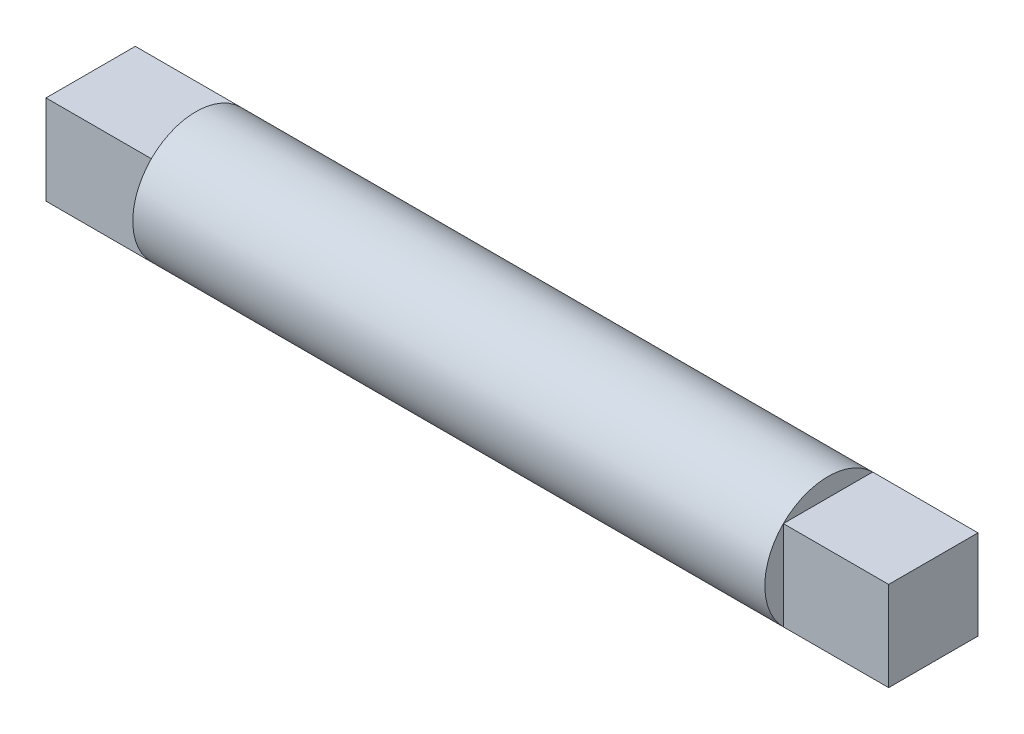
ISO-10303-21;
HEADER;
FILE_DESCRIPTION(('STEP AP214'),'2;1');
FILE_NAME('part.step','',(''),(''),'','','');
FILE_SCHEMA(('AUTOMOTIVE_DESIGN { 1 0 10303 214 1 1 1 1 }'));
ENDSEC;
DATA;
#1=APPLICATION_CONTEXT('core data for automotive mechanical design processes');
#2=APPLICATION_PROTOCOL_DEFINITION('international standard','automotive_design',2000,#1);
#3=PRODUCT_CONTEXT('',#1,'mechanical');
#4=PRODUCT('Part','Part','',(#3));
#5=PRODUCT_RELATED_PRODUCT_CATEGORY('part','',(#4));
#6=PRODUCT_DEFINITION_FORMATION('','',#4);
#7=PRODUCT_DEFINITION_CONTEXT('part definition',#1,'design');
#8=PRODUCT_DEFINITION('design','',#6,#7);
#9=PRODUCT_DEFINITION_SHAPE('','',#8);
#10=(LENGTH_UNIT() NAMED_UNIT(*) SI_UNIT(.MILLI.,.METRE.));
#11=(NAMED_UNIT(*) PLANE_ANGLE_UNIT() SI_UNIT($,.RADIAN.));
#12=(NAMED_UNIT(*) SI_UNIT($,.STERADIAN.) SOLID_ANGLE_UNIT());
#13=UNCERTAINTY_MEASURE_WITH_UNIT(LENGTH_MEASURE(1.E-05),#10,'distance_accuracy_value','');
#14=(GEOMETRIC_REPRESENTATION_CONTEXT(3) GLOBAL_UNCERTAINTY_ASSIGNED_CONTEXT((#13)) GLOBAL_UNIT_ASSIGNED_CONTEXT((#10,
#11,#12)) REPRESENTATION_CONTEXT('',''));
#15=CARTESIAN_POINT('',(0.,0.,0.));
#16=DIRECTION('',(0.,0.,1.));
#17=DIRECTION('',(1.,0.,0.));
#18=AXIS2_PLACEMENT_3D('',#15,#16,#17);
#19=CARTESIAN_POINT('',(-15.,0.,0.));
#20=DIRECTION('',(-1.,0.,0.));
#21=DIRECTION('',(0.,0.,-1.));
#22=AXIS2_PLACEMENT_3D('',#19,#20,#21);
#23=PLANE('',#22);
#24=CARTESIAN_POINT('',(-15.,0.,0.));
#25=DIRECTION('',(1.,0.,0.));
#26=DIRECTION('',(0.,0.,-1.));
#27=AXIS2_PLACEMENT_3D('',#24,#25,#26);
#28=CIRCLE('',#27,3.);
#29=CARTESIAN_POINT('',(-15.,-2.12263986582746,-2.12));
#30=VERTEX_POINT('',#29);
#31=CARTESIAN_POINT('',(-15.,2.12263986582746,-2.12));
#32=VERTEX_POINT('',#31);
#33=EDGE_CURVE('E106',#30,#32,#28,.T.);
#34=ORIENTED_EDGE('',*,*,#33,.F.);
#35=DIRECTION('',(0.,1.,0.));
#36=VECTOR('',#35,1.);
#37=CARTESIAN_POINT('',(-15.,2.12263986582746,-2.12));
#38=LINE('',#37,#36);
#39=EDGE_CURVE('E49',#30,#32,#38,.T.);
#40=ORIENTED_EDGE('',*,*,#39,.T.);
#41=EDGE_LOOP('',(#34,#40));
#42=FACE_BOUND('',#41,.T.);
#43=ADVANCED_FACE('F33',(#42),#23,.T.);
#44=CARTESIAN_POINT('',(-15.,2.12263986582746,2.12));
#45=VERTEX_POINT('',#44);
#46=EDGE_CURVE('E138',#32,#45,#28,.T.);
#47=ORIENTED_EDGE('',*,*,#46,.F.);
#48=DIRECTION('',(0.,0.,1.));
#49=VECTOR('',#48,1.);
#50=CARTESIAN_POINT('',(-15.,2.12263986582746,2.12));
#51=LINE('',#50,#49);
#52=EDGE_CURVE('E117',#32,#45,#51,.T.);
#53=ORIENTED_EDGE('',*,*,#52,.T.);
#54=EDGE_LOOP('',(#47,#53));
#55=FACE_BOUND('',#54,.T.);
#56=ADVANCED_FACE('F208',(#55),#23,.T.);
#57=CARTESIAN_POINT('',(-15.,-2.12263986582746,2.12));
#58=VERTEX_POINT('',#57);
#59=EDGE_CURVE('E141',#45,#58,#28,.T.);
#60=ORIENTED_EDGE('',*,*,#59,.F.);
#61=DIRECTION('',(0.,-1.,0.));
#62=VECTOR('',#61,1.);
#63=CARTESIAN_POINT('',(-15.,2.12263986582746,2.12));
#64=LINE('',#63,#62);
#65=EDGE_CURVE('E129',#45,#58,#64,.T.);
#66=ORIENTED_EDGE('',*,*,#65,.T.);
#67=EDGE_LOOP('',(#60,#66));
#68=FACE_BOUND('',#67,.T.);
#69=ADVANCED_FACE('F212',(#68),#23,.T.);
#70=EDGE_CURVE('E215',#58,#30,#28,.T.);
#71=ORIENTED_EDGE('',*,*,#70,.F.);
#72=DIRECTION('',(0.,0.,-1.));
#73=VECTOR('',#72,1.);
#74=CARTESIAN_POINT('',(-15.,-2.12263986582746,2.12));
#75=LINE('',#74,#73);
#76=EDGE_CURVE('E127',#58,#30,#75,.T.);
#77=ORIENTED_EDGE('',*,*,#76,.T.);
#78=EDGE_LOOP('',(#71,#77));
#79=FACE_BOUND('',#78,.T.);
#80=ADVANCED_FACE('F217',(#79),#23,.T.);
#81=CARTESIAN_POINT('',(15.,0.,0.));
#82=DIRECTION('',(1.,0.,0.));
#83=DIRECTION('',(0.,0.,-1.));
#84=AXIS2_PLACEMENT_3D('',#81,#82,#83);
#85=PLANE('',#84);
#86=DIRECTION('',(0.,1.,0.));
#87=VECTOR('',#86,1.);
#88=CARTESIAN_POINT('',(15.,2.12263986582746,-2.12));
#89=LINE('',#88,#87);
#90=CARTESIAN_POINT('',(15.,-2.12263986582746,-2.12));
#91=VERTEX_POINT('',#90);
#92=CARTESIAN_POINT('',(15.,2.12263986582746,-2.12));
#93=VERTEX_POINT('',#92);
#94=EDGE_CURVE('E56',#91,#93,#89,.T.);
#95=ORIENTED_EDGE('',*,*,#94,.F.);
#96=CARTESIAN_POINT('',(15.,0.,0.));
#97=DIRECTION('',(1.,0.,0.));
#98=DIRECTION('',(0.,0.,-1.));
#99=AXIS2_PLACEMENT_3D('',#96,#97,#98);
#100=CIRCLE('',#99,3.);
#101=EDGE_CURVE('E42',#91,#93,#100,.T.);
#102=ORIENTED_EDGE('',*,*,#101,.T.);
#103=EDGE_LOOP('',(#95,#102));
#104=FACE_BOUND('',#103,.T.);
#105=ADVANCED_FACE('F227',(#104),#85,.T.);
#106=DIRECTION('',(0.,0.,-1.));
#107=VECTOR('',#106,1.);
#108=CARTESIAN_POINT('',(15.,-2.12263986582746,2.12));
#109=LINE('',#108,#107);
#110=CARTESIAN_POINT('',(15.,-2.12263986582746,2.12));
#111=VERTEX_POINT('',#110);
#112=EDGE_CURVE('E146',#111,#91,#109,.T.);
#113=ORIENTED_EDGE('',*,*,#112,.F.);
#114=EDGE_CURVE('E173',#111,#91,#100,.T.);
#115=ORIENTED_EDGE('',*,*,#114,.T.);
#116=EDGE_LOOP('',(#113,#115));
#117=FACE_BOUND('',#116,.T.);
#118=ADVANCED_FACE('F232',(#117),#85,.T.);
#119=DIRECTION('',(0.,-1.,0.));
#120=VECTOR('',#119,1.);
#121=CARTESIAN_POINT('',(15.,2.12263986582746,2.12));
#122=LINE('',#121,#120);
#123=CARTESIAN_POINT('',(15.,2.12263986582746,2.12));
#124=VERTEX_POINT('',#123);
#125=EDGE_CURVE('E157',#124,#111,#122,.T.);
#126=ORIENTED_EDGE('',*,*,#125,.F.);
#127=EDGE_CURVE('E41',#124,#111,#100,.T.);
#128=ORIENTED_EDGE('',*,*,#127,.T.);
#129=EDGE_LOOP('',(#126,#128));
#130=FACE_BOUND('',#129,.T.);
#131=ADVANCED_FACE('F182',(#130),#85,.T.);
#132=CARTESIAN_POINT('',(15.,0.,0.));
#133=DIRECTION('',(-1.,0.,0.));
#134=DIRECTION('',(0.,0.,1.));
#135=AXIS2_PLACEMENT_3D('',#132,#133,#134);
#136=CYLINDRICAL_SURFACE('',#135,3.);
#137=EDGE_CURVE('E11',#93,#124,#100,.T.);
#138=ORIENTED_EDGE('',*,*,#137,.F.);
#139=ORIENTED_EDGE('',*,*,#101,.F.);
#140=ORIENTED_EDGE('',*,*,#114,.F.);
#141=ORIENTED_EDGE('',*,*,#127,.F.);
#142=EDGE_LOOP('',(#138,#139,#140,#141));
#143=FACE_BOUND('',#142,.T.);
#144=ORIENTED_EDGE('',*,*,#46,.T.);
#145=ORIENTED_EDGE('',*,*,#59,.T.);
#146=ORIENTED_EDGE('',*,*,#70,.T.);
#147=ORIENTED_EDGE('',*,*,#33,.T.);
#148=EDGE_LOOP('',(#144,#145,#146,#147));
#149=FACE_BOUND('',#148,.T.);
#150=ADVANCED_FACE('F35',(#143,#149),#136,.T.);
#151=DIRECTION('',(0.,0.,1.));
#152=VECTOR('',#151,1.);
#153=CARTESIAN_POINT('',(15.,2.12263986582746,2.12));
#154=LINE('',#153,#152);
#155=EDGE_CURVE('E154',#93,#124,#154,.T.);
#156=ORIENTED_EDGE('',*,*,#155,.F.);
#157=ORIENTED_EDGE('',*,*,#137,.T.);
#158=EDGE_LOOP('',(#156,#157));
#159=FACE_BOUND('',#158,.T.);
#160=ADVANCED_FACE('F198',(#159),#85,.T.);
#161=CARTESIAN_POINT('',(20.,2.12263986582746,-2.12));
#162=DIRECTION('',(0.,0.,1.));
#163=DIRECTION('',(1.,0.,0.));
#164=AXIS2_PLACEMENT_3D('',#161,#162,#163);
#165=PLANE('',#164);
#166=ORIENTED_EDGE('',*,*,#94,.T.);
#167=DIRECTION('',(-1.,0.,0.));
#168=VECTOR('',#167,1.);
#169=CARTESIAN_POINT('',(20.,2.12263986582746,-2.12));
#170=LINE('',#169,#168);
#171=CARTESIAN_POINT('',(20.,2.12263986582746,-2.12));
#172=VERTEX_POINT('',#171);
#173=EDGE_CURVE('E169',#172,#93,#170,.T.);
#174=ORIENTED_EDGE('',*,*,#173,.F.);
#175=DIRECTION('',(0.,1.,0.));
#176=VECTOR('',#175,1.);
#177=CARTESIAN_POINT('',(20.,2.12263986582746,-2.12));
#178=LINE('',#177,#176);
#179=CARTESIAN_POINT('',(20.,-2.12263986582746,-2.12));
#180=VERTEX_POINT('',#179);
#181=EDGE_CURVE('E142',#180,#172,#178,.T.);
#182=ORIENTED_EDGE('',*,*,#181,.F.);
#183=DIRECTION('',(-1.,0.,0.));
#184=VECTOR('',#183,1.);
#185=CARTESIAN_POINT('',(20.,-2.12263986582746,-2.12));
#186=LINE('',#185,#184);
#187=EDGE_CURVE('E152',#180,#91,#186,.T.);
#188=ORIENTED_EDGE('',*,*,#187,.T.);
#189=EDGE_LOOP('',(#166,#174,#182,#188));
#190=FACE_BOUND('',#189,.T.);
#191=ADVANCED_FACE('F278',(#190),#165,.F.);
#192=CARTESIAN_POINT('',(20.,2.12263986582746,2.12));
#193=DIRECTION('',(0.,-1.,0.));
#194=DIRECTION('',(0.,0.,-1.));
#195=AXIS2_PLACEMENT_3D('',#192,#193,#194);
#196=PLANE('',#195);
#197=ORIENTED_EDGE('',*,*,#155,.T.);
#198=DIRECTION('',(-1.,0.,0.));
#199=VECTOR('',#198,1.);
#200=CARTESIAN_POINT('',(20.,2.12263986582746,2.12));
#201=LINE('',#200,#199);
#202=CARTESIAN_POINT('',(20.,2.12263986582746,2.12));
#203=VERTEX_POINT('',#202);
#204=EDGE_CURVE('E167',#203,#124,#201,.T.);
#205=ORIENTED_EDGE('',*,*,#204,.F.);
#206=DIRECTION('',(0.,0.,1.));
#207=VECTOR('',#206,1.);
#208=CARTESIAN_POINT('',(20.,2.12263986582746,2.12));
#209=LINE('',#208,#207);
#210=EDGE_CURVE('E145',#172,#203,#209,.T.);
#211=ORIENTED_EDGE('',*,*,#210,.F.);
#212=ORIENTED_EDGE('',*,*,#173,.T.);
#213=EDGE_LOOP('',(#197,#205,#211,#212));
#214=FACE_BOUND('',#213,.T.);
#215=ADVANCED_FACE('F196',(#214),#196,.F.);
#216=CARTESIAN_POINT('',(20.,2.12263986582746,2.12));
#217=DIRECTION('',(0.,0.,-1.));
#218=DIRECTION('',(-1.,0.,0.));
#219=AXIS2_PLACEMENT_3D('',#216,#217,#218);
#220=PLANE('',#219);
#221=ORIENTED_EDGE('',*,*,#125,.T.);
#222=DIRECTION('',(-1.,0.,0.));
#223=VECTOR('',#222,1.);
#224=CARTESIAN_POINT('',(20.,-2.12263986582746,2.12));
#225=LINE('',#224,#223);
#226=CARTESIAN_POINT('',(20.,-2.12263986582746,2.12));
#227=VERTEX_POINT('',#226);
#228=EDGE_CURVE('E164',#227,#111,#225,.T.);
#229=ORIENTED_EDGE('',*,*,#228,.F.);
#230=DIRECTION('',(0.,-1.,0.));
#231=VECTOR('',#230,1.);
#232=CARTESIAN_POINT('',(20.,2.12263986582746,2.12));
#233=LINE('',#232,#231);
#234=EDGE_CURVE('E148',#203,#227,#233,.T.);
#235=ORIENTED_EDGE('',*,*,#234,.F.);
#236=ORIENTED_EDGE('',*,*,#204,.T.);
#237=EDGE_LOOP('',(#221,#229,#235,#236));
#238=FACE_BOUND('',#237,.T.);
#239=ADVANCED_FACE('F186',(#238),#220,.F.);
#240=CARTESIAN_POINT('',(20.,-2.12263986582746,2.12));
#241=DIRECTION('',(0.,1.,0.));
#242=DIRECTION('',(0.,0.,1.));
#243=AXIS2_PLACEMENT_3D('',#240,#241,#242);
#244=PLANE('',#243);
#245=ORIENTED_EDGE('',*,*,#112,.T.);
#246=ORIENTED_EDGE('',*,*,#187,.F.);
#247=DIRECTION('',(0.,0.,-1.));
#248=VECTOR('',#247,1.);
#249=CARTESIAN_POINT('',(20.,-2.12263986582746,2.12));
#250=LINE('',#249,#248);
#251=EDGE_CURVE('E150',#227,#180,#250,.T.);
#252=ORIENTED_EDGE('',*,*,#251,.F.);
#253=ORIENTED_EDGE('',*,*,#228,.T.);
#254=EDGE_LOOP('',(#245,#246,#252,#253));
#255=FACE_BOUND('',#254,.T.);
#256=ADVANCED_FACE('F191',(#255),#244,.F.);
#257=CARTESIAN_POINT('',(20.,0.,0.));
#258=DIRECTION('',(1.,0.,0.));
#259=DIRECTION('',(0.,0.,-1.));
#260=AXIS2_PLACEMENT_3D('',#257,#258,#259);
#261=PLANE('',#260);
#262=ORIENTED_EDGE('',*,*,#181,.T.);
#263=ORIENTED_EDGE('',*,*,#210,.T.);
#264=ORIENTED_EDGE('',*,*,#234,.T.);
#265=ORIENTED_EDGE('',*,*,#251,.T.);
#266=EDGE_LOOP('',(#262,#263,#264,#265));
#267=FACE_BOUND('',#266,.T.);
#268=ADVANCED_FACE('F195',(#267),#261,.T.);
#269=CARTESIAN_POINT('',(-20.,2.12263986582746,-2.12));
#270=DIRECTION('',(0.,0.,-1.));
#271=DIRECTION('',(-1.,0.,0.));
#272=AXIS2_PLACEMENT_3D('',#269,#270,#271);
#273=PLANE('',#272);
#274=ORIENTED_EDGE('',*,*,#39,.F.);
#275=DIRECTION('',(1.,0.,0.));
#276=VECTOR('',#275,1.);
#277=CARTESIAN_POINT('',(-20.,-2.12263986582746,-2.12));
#278=LINE('',#277,#276);
#279=CARTESIAN_POINT('',(-20.,-2.12263986582746,-2.12));
#280=VERTEX_POINT('',#279);
#281=EDGE_CURVE('E97',#280,#30,#278,.T.);
#282=ORIENTED_EDGE('',*,*,#281,.F.);
#283=DIRECTION('',(0.,1.,0.));
#284=VECTOR('',#283,1.);
#285=CARTESIAN_POINT('',(-20.,2.12263986582746,-2.12));
#286=LINE('',#285,#284);
#287=CARTESIAN_POINT('',(-20.,2.12263986582746,-2.12));
#288=VERTEX_POINT('',#287);
#289=EDGE_CURVE('E100',#280,#288,#286,.T.);
#290=ORIENTED_EDGE('',*,*,#289,.T.);
#291=DIRECTION('',(1.,0.,0.));
#292=VECTOR('',#291,1.);
#293=CARTESIAN_POINT('',(-20.,2.12263986582746,-2.12));
#294=LINE('',#293,#292);
#295=EDGE_CURVE('E125',#288,#32,#294,.T.);
#296=ORIENTED_EDGE('',*,*,#295,.T.);
#297=EDGE_LOOP('',(#274,#282,#290,#296));
#298=FACE_BOUND('',#297,.T.);
#299=ADVANCED_FACE('F99',(#298),#273,.T.);
#300=CARTESIAN_POINT('',(-20.,-2.12263986582746,2.12));
#301=DIRECTION('',(0.,-1.,0.));
#302=DIRECTION('',(0.,0.,-1.));
#303=AXIS2_PLACEMENT_3D('',#300,#301,#302);
#304=PLANE('',#303);
#305=ORIENTED_EDGE('',*,*,#76,.F.);
#306=DIRECTION('',(1.,0.,0.));
#307=VECTOR('',#306,1.);
#308=CARTESIAN_POINT('',(-20.,-2.12263986582746,2.12));
#309=LINE('',#308,#307);
#310=CARTESIAN_POINT('',(-20.,-2.12263986582746,2.12));
#311=VERTEX_POINT('',#310);
#312=EDGE_CURVE('E107',#311,#58,#309,.T.);
#313=ORIENTED_EDGE('',*,*,#312,.F.);
#314=DIRECTION('',(0.,0.,-1.));
#315=VECTOR('',#314,1.);
#316=CARTESIAN_POINT('',(-20.,-2.12263986582746,2.12));
#317=LINE('',#316,#315);
#318=EDGE_CURVE('E113',#311,#280,#317,.T.);
#319=ORIENTED_EDGE('',*,*,#318,.T.);
#320=ORIENTED_EDGE('',*,*,#281,.T.);
#321=EDGE_LOOP('',(#305,#313,#319,#320));
#322=FACE_BOUND('',#321,.T.);
#323=ADVANCED_FACE('F119',(#322),#304,.T.);
#324=CARTESIAN_POINT('',(-20.,2.12263986582746,2.12));
#325=DIRECTION('',(0.,0.,1.));
#326=DIRECTION('',(1.,0.,0.));
#327=AXIS2_PLACEMENT_3D('',#324,#325,#326);
#328=PLANE('',#327);
#329=ORIENTED_EDGE('',*,*,#65,.F.);
#330=DIRECTION('',(1.,0.,0.));
#331=VECTOR('',#330,1.);
#332=CARTESIAN_POINT('',(-20.,2.12263986582746,2.12));
#333=LINE('',#332,#331);
#334=CARTESIAN_POINT('',(-20.,2.12263986582746,2.12));
#335=VERTEX_POINT('',#334);
#336=EDGE_CURVE('E135',#335,#45,#333,.T.);
#337=ORIENTED_EDGE('',*,*,#336,.F.);
#338=DIRECTION('',(0.,-1.,0.));
#339=VECTOR('',#338,1.);
#340=CARTESIAN_POINT('',(-20.,2.12263986582746,2.12));
#341=LINE('',#340,#339);
#342=EDGE_CURVE('E120',#335,#311,#341,.T.);
#343=ORIENTED_EDGE('',*,*,#342,.T.);
#344=ORIENTED_EDGE('',*,*,#312,.T.);
#345=EDGE_LOOP('',(#329,#337,#343,#344));
#346=FACE_BOUND('',#345,.T.);
#347=ADVANCED_FACE('F336',(#346),#328,.T.);
#348=CARTESIAN_POINT('',(-20.,2.12263986582746,2.12));
#349=DIRECTION('',(0.,1.,0.));
#350=DIRECTION('',(0.,0.,1.));
#351=AXIS2_PLACEMENT_3D('',#348,#349,#350);
#352=PLANE('',#351);
#353=ORIENTED_EDGE('',*,*,#52,.F.);
#354=ORIENTED_EDGE('',*,*,#295,.F.);
#355=DIRECTION('',(0.,0.,1.));
#356=VECTOR('',#355,1.);
#357=CARTESIAN_POINT('',(-20.,2.12263986582746,2.12));
#358=LINE('',#357,#356);
#359=EDGE_CURVE('E116',#288,#335,#358,.T.);
#360=ORIENTED_EDGE('',*,*,#359,.T.);
#361=ORIENTED_EDGE('',*,*,#336,.T.);
#362=EDGE_LOOP('',(#353,#354,#360,#361));
#363=FACE_BOUND('',#362,.T.);
#364=ADVANCED_FACE('F345',(#363),#352,.T.);
#365=CARTESIAN_POINT('',(-20.,0.,0.));
#366=DIRECTION('',(-1.,0.,0.));
#367=DIRECTION('',(0.,0.,-1.));
#368=AXIS2_PLACEMENT_3D('',#365,#366,#367);
#369=PLANE('',#368);
#370=ORIENTED_EDGE('',*,*,#289,.F.);
#371=ORIENTED_EDGE('',*,*,#318,.F.);
#372=ORIENTED_EDGE('',*,*,#342,.F.);
#373=ORIENTED_EDGE('',*,*,#359,.F.);
#374=EDGE_LOOP('',(#370,#371,#372,#373));
#375=FACE_BOUND('',#374,.T.);
#376=ADVANCED_FACE('F111',(#375),#369,.T.);
#377=CLOSED_SHELL('',(#43,#56,#69,#80,#105,#118,#131,#150,#160,#191,#215,#239,#256,#268,#299,
#323,#347,#364,#376));
#378=MANIFOLD_SOLID_BREP('B2',#377);
#379=ADVANCED_BREP_SHAPE_REPRESENTATION('',(#18,#378),#14);
#380=SHAPE_DEFINITION_REPRESENTATION(#9,#379);
ENDSEC;
END-ISO-10303-21;
